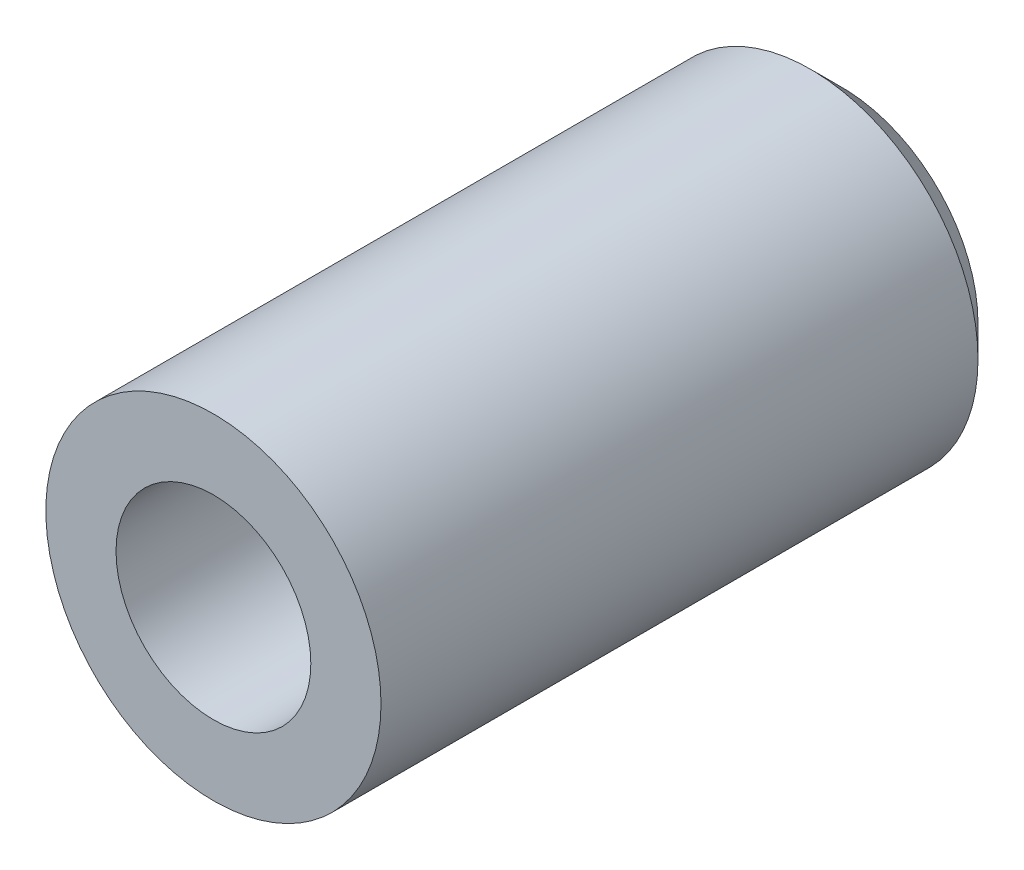
ISO-10303-21;
HEADER;
FILE_DESCRIPTION(('STEP AP214'),'2;1');
FILE_NAME('part.step','',(''),(''),'','','');
FILE_SCHEMA(('AUTOMOTIVE_DESIGN { 1 0 10303 214 1 1 1 1 }'));
ENDSEC;
DATA;
#1=APPLICATION_CONTEXT('core data for automotive mechanical design processes');
#2=APPLICATION_PROTOCOL_DEFINITION('international standard','automotive_design',2000,#1);
#3=PRODUCT_CONTEXT('',#1,'mechanical');
#4=PRODUCT('Part','Part','',(#3));
#5=PRODUCT_RELATED_PRODUCT_CATEGORY('part','',(#4));
#6=PRODUCT_DEFINITION_FORMATION('','',#4);
#7=PRODUCT_DEFINITION_CONTEXT('part definition',#1,'design');
#8=PRODUCT_DEFINITION('design','',#6,#7);
#9=PRODUCT_DEFINITION_SHAPE('','',#8);
#10=(LENGTH_UNIT() NAMED_UNIT(*) SI_UNIT(.MILLI.,.METRE.));
#11=(NAMED_UNIT(*) PLANE_ANGLE_UNIT() SI_UNIT($,.RADIAN.));
#12=(NAMED_UNIT(*) SI_UNIT($,.STERADIAN.) SOLID_ANGLE_UNIT());
#13=UNCERTAINTY_MEASURE_WITH_UNIT(LENGTH_MEASURE(1.E-05),#10,'distance_accuracy_value','');
#14=(GEOMETRIC_REPRESENTATION_CONTEXT(3) GLOBAL_UNCERTAINTY_ASSIGNED_CONTEXT((#13)) GLOBAL_UNIT_ASSIGNED_CONTEXT((#10,
#11,#12)) REPRESENTATION_CONTEXT('',''));
#15=CARTESIAN_POINT('',(0.,0.,0.));
#16=DIRECTION('',(0.,0.,1.));
#17=DIRECTION('',(1.,0.,0.));
#18=AXIS2_PLACEMENT_3D('',#15,#16,#17);
#19=CARTESIAN_POINT('',(0.,0.,0.));
#20=DIRECTION('',(0.,0.,1.));
#21=DIRECTION('',(1.,0.,0.));
#22=AXIS2_PLACEMENT_3D('',#19,#20,#21);
#23=PLANE('',#22);
#24=CARTESIAN_POINT('',(0.,0.,0.));
#25=DIRECTION('',(0.,0.,1.));
#26=DIRECTION('',(1.,0.,0.));
#27=AXIS2_PLACEMENT_3D('',#24,#25,#26);
#28=CIRCLE('',#27,4.65);
#29=CARTESIAN_POINT('',(4.65,0.,0.));
#30=VERTEX_POINT('',#29);
#31=EDGE_CURVE('E30',#30,#30,#28,.T.);
#32=ORIENTED_EDGE('',*,*,#31,.T.);
#33=EDGE_LOOP('',(#32));
#34=FACE_BOUND('',#33,.T.);
#35=CARTESIAN_POINT('',(0.,0.,0.));
#36=DIRECTION('',(0.,0.,-1.));
#37=DIRECTION('',(-1.,0.,0.));
#38=AXIS2_PLACEMENT_3D('',#35,#36,#37);
#39=CIRCLE('',#38,6.5);
#40=CARTESIAN_POINT('',(-6.5,0.,0.));
#41=VERTEX_POINT('',#40);
#42=EDGE_CURVE('E34',#41,#41,#39,.T.);
#43=ORIENTED_EDGE('',*,*,#42,.T.);
#44=EDGE_LOOP('',(#43));
#45=FACE_BOUND('',#44,.T.);
#46=ADVANCED_FACE('F15',(#34,#45),#23,.F.);
#47=CARTESIAN_POINT('',(0.,0.,30.));
#48=DIRECTION('',(0.,0.,-1.));
#49=DIRECTION('',(-1.,0.,0.));
#50=AXIS2_PLACEMENT_3D('',#47,#48,#49);
#51=CYLINDRICAL_SURFACE('',#50,8.);
#52=CARTESIAN_POINT('',(0.,0.,1.49999999999996));
#53=DIRECTION('',(0.,0.,1.));
#54=DIRECTION('',(1.,0.,0.));
#55=AXIS2_PLACEMENT_3D('',#52,#53,#54);
#56=CIRCLE('',#55,8.);
#57=CARTESIAN_POINT('',(8.,0.,1.49999999999996));
#58=VERTEX_POINT('',#57);
#59=EDGE_CURVE('E10',#58,#58,#56,.T.);
#60=ORIENTED_EDGE('',*,*,#59,.T.);
#61=EDGE_LOOP('',(#60));
#62=FACE_BOUND('',#61,.T.);
#63=CARTESIAN_POINT('',(0.,0.,30.));
#64=DIRECTION('',(0.,0.,1.));
#65=DIRECTION('',(1.,0.,0.));
#66=AXIS2_PLACEMENT_3D('',#63,#64,#65);
#67=CIRCLE('',#66,8.);
#68=CARTESIAN_POINT('',(8.,0.,30.));
#69=VERTEX_POINT('',#68);
#70=EDGE_CURVE('E22',#69,#69,#67,.T.);
#71=ORIENTED_EDGE('',*,*,#70,.F.);
#72=EDGE_LOOP('',(#71));
#73=FACE_BOUND('',#72,.T.);
#74=ADVANCED_FACE('F52',(#62,#73),#51,.T.);
#75=CARTESIAN_POINT('',(0.,0.,30.));
#76=DIRECTION('',(0.,0.,1.));
#77=DIRECTION('',(1.,0.,0.));
#78=AXIS2_PLACEMENT_3D('',#75,#76,#77);
#79=PLANE('',#78);
#80=ORIENTED_EDGE('',*,*,#70,.T.);
#81=EDGE_LOOP('',(#80));
#82=FACE_BOUND('',#81,.T.);
#83=CARTESIAN_POINT('',(0.,0.,30.));
#84=DIRECTION('',(0.,0.,1.));
#85=DIRECTION('',(1.,0.,0.));
#86=AXIS2_PLACEMENT_3D('',#83,#84,#85);
#87=CIRCLE('',#86,4.65);
#88=CARTESIAN_POINT('',(4.65,0.,30.));
#89=VERTEX_POINT('',#88);
#90=EDGE_CURVE('E26',#89,#89,#87,.T.);
#91=ORIENTED_EDGE('',*,*,#90,.F.);
#92=EDGE_LOOP('',(#91));
#93=FACE_BOUND('',#92,.T.);
#94=ADVANCED_FACE('F48',(#82,#93),#79,.T.);
#95=CARTESIAN_POINT('',(0.,0.,30.));
#96=DIRECTION('',(0.,0.,-1.));
#97=DIRECTION('',(-1.,0.,0.));
#98=AXIS2_PLACEMENT_3D('',#95,#96,#97);
#99=CYLINDRICAL_SURFACE('',#98,4.65);
#100=ORIENTED_EDGE('',*,*,#90,.T.);
#101=EDGE_LOOP('',(#100));
#102=FACE_BOUND('',#101,.T.);
#103=ORIENTED_EDGE('',*,*,#31,.F.);
#104=EDGE_LOOP('',(#103));
#105=FACE_BOUND('',#104,.T.);
#106=ADVANCED_FACE('F41',(#102,#105),#99,.F.);
#107=CARTESIAN_POINT('',(0.,0.,0.));
#108=DIRECTION('',(0.,0.,1.));
#109=DIRECTION('',(1.,0.,0.));
#110=AXIS2_PLACEMENT_3D('',#107,#108,#109);
#111=CONICAL_SURFACE('',#110,6.5,0.785398163397443);
#112=ORIENTED_EDGE('',*,*,#59,.F.);
#113=EDGE_LOOP('',(#112));
#114=FACE_BOUND('',#113,.T.);
#115=ORIENTED_EDGE('',*,*,#42,.F.);
#116=EDGE_LOOP('',(#115));
#117=FACE_BOUND('',#116,.T.);
#118=ADVANCED_FACE('F17',(#114,#117),#111,.T.);
#119=CLOSED_SHELL('',(#46,#74,#94,#106,#118));
#120=MANIFOLD_SOLID_BREP('B1',#119);
#121=ADVANCED_BREP_SHAPE_REPRESENTATION('',(#18,#120),#14);
#122=SHAPE_DEFINITION_REPRESENTATION(#9,#121);
ENDSEC;
END-ISO-10303-21;
